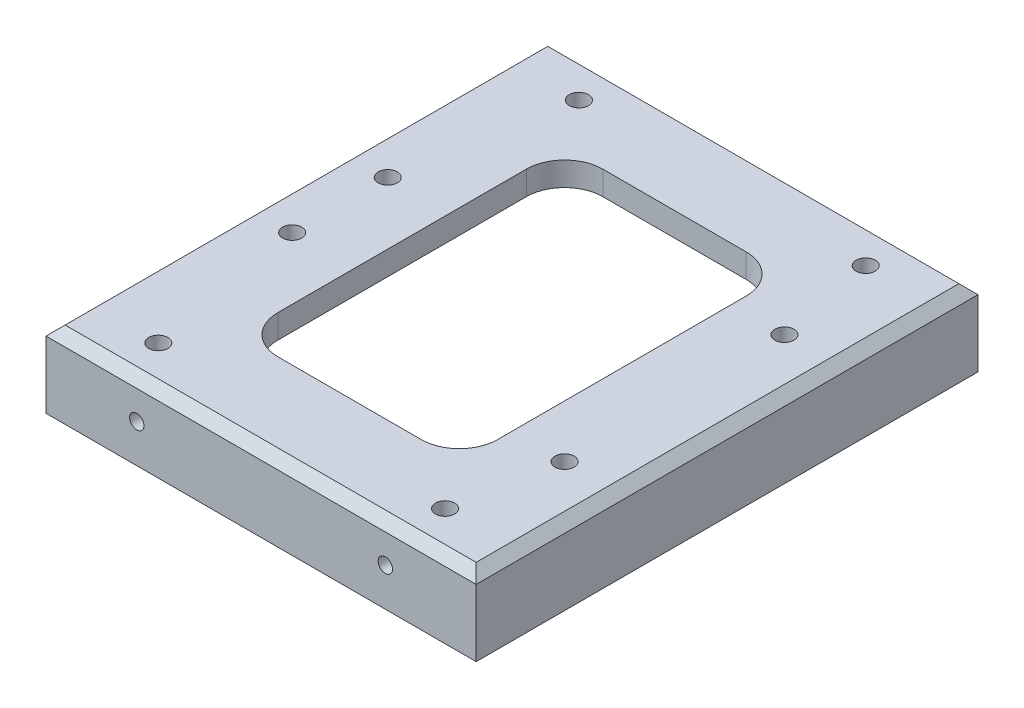
ISO-10303-21;
HEADER;
FILE_DESCRIPTION(('STEP AP214'),'2;1');
FILE_NAME('part.step','',(''),(''),'','','');
FILE_SCHEMA(('AUTOMOTIVE_DESIGN { 1 0 10303 214 1 1 1 1 }'));
ENDSEC;
DATA;
#1=APPLICATION_CONTEXT('core data for automotive mechanical design processes');
#2=APPLICATION_PROTOCOL_DEFINITION('international standard','automotive_design',2000,#1);
#3=PRODUCT_CONTEXT('',#1,'mechanical');
#4=PRODUCT('Part','Part','',(#3));
#5=PRODUCT_RELATED_PRODUCT_CATEGORY('part','',(#4));
#6=PRODUCT_DEFINITION_FORMATION('','',#4);
#7=PRODUCT_DEFINITION_CONTEXT('part definition',#1,'design');
#8=PRODUCT_DEFINITION('design','',#6,#7);
#9=PRODUCT_DEFINITION_SHAPE('','',#8);
#10=(LENGTH_UNIT() NAMED_UNIT(*) SI_UNIT(.MILLI.,.METRE.));
#11=(NAMED_UNIT(*) PLANE_ANGLE_UNIT() SI_UNIT($,.RADIAN.));
#12=(NAMED_UNIT(*) SI_UNIT($,.STERADIAN.) SOLID_ANGLE_UNIT());
#13=UNCERTAINTY_MEASURE_WITH_UNIT(LENGTH_MEASURE(1.E-05),#10,'distance_accuracy_value','');
#14=(GEOMETRIC_REPRESENTATION_CONTEXT(3) GLOBAL_UNCERTAINTY_ASSIGNED_CONTEXT((#13)) GLOBAL_UNIT_ASSIGNED_CONTEXT((#10,
#11,#12)) REPRESENTATION_CONTEXT('',''));
#15=CARTESIAN_POINT('',(0.,0.,0.));
#16=DIRECTION('',(0.,0.,1.));
#17=DIRECTION('',(1.,0.,0.));
#18=AXIS2_PLACEMENT_3D('',#15,#16,#17);
#19=CARTESIAN_POINT('',(45.,16.,-52.5));
#20=DIRECTION('',(-1.,0.,0.));
#21=DIRECTION('',(0.,0.,1.));
#22=AXIS2_PLACEMENT_3D('',#19,#20,#21);
#23=PLANE('',#22);
#24=DIRECTION('',(0.,-1.,0.));
#25=VECTOR('',#24,1.);
#26=CARTESIAN_POINT('',(45.,16.,-52.5));
#27=LINE('',#26,#25);
#28=CARTESIAN_POINT('',(45.,14.,-52.5));
#29=VERTEX_POINT('',#28);
#30=CARTESIAN_POINT('',(45.,0.,-52.5));
#31=VERTEX_POINT('',#30);
#32=EDGE_CURVE('E267',#29,#31,#27,.T.);
#33=ORIENTED_EDGE('',*,*,#32,.F.);
#34=DIRECTION('',(0.,0.,1.));
#35=VECTOR('',#34,1.);
#36=CARTESIAN_POINT('',(45.,14.,52.5));
#37=LINE('',#36,#35);
#38=CARTESIAN_POINT('',(45.,14.,52.5));
#39=VERTEX_POINT('',#38);
#40=EDGE_CURVE('E278',#29,#39,#37,.T.);
#41=ORIENTED_EDGE('',*,*,#40,.T.);
#42=DIRECTION('',(0.,-1.,0.));
#43=VECTOR('',#42,1.);
#44=CARTESIAN_POINT('',(45.,16.,52.5));
#45=LINE('',#44,#43);
#46=CARTESIAN_POINT('',(45.,0.,52.5));
#47=VERTEX_POINT('',#46);
#48=EDGE_CURVE('E261',#39,#47,#45,.T.);
#49=ORIENTED_EDGE('',*,*,#48,.T.);
#50=DIRECTION('',(0.,0.,-1.));
#51=VECTOR('',#50,1.);
#52=CARTESIAN_POINT('',(45.,0.,-52.5));
#53=LINE('',#52,#51);
#54=EDGE_CURVE('E248',#47,#31,#53,.T.);
#55=ORIENTED_EDGE('',*,*,#54,.T.);
#56=EDGE_LOOP('',(#33,#41,#49,#55));
#57=FACE_BOUND('',#56,.T.);
#58=ADVANCED_FACE('F39',(#57),#23,.F.);
#59=CARTESIAN_POINT('',(-45.,16.,-52.5));
#60=DIRECTION('',(0.,0.,1.));
#61=DIRECTION('',(1.,0.,0.));
#62=AXIS2_PLACEMENT_3D('',#59,#60,#61);
#63=PLANE('',#62);
#64=DIRECTION('',(0.,-1.,0.));
#65=VECTOR('',#64,1.);
#66=CARTESIAN_POINT('',(-45.,16.,-52.5));
#67=LINE('',#66,#65);
#68=CARTESIAN_POINT('',(-45.,14.,-52.5));
#69=VERTEX_POINT('',#68);
#70=CARTESIAN_POINT('',(-45.,0.,-52.5));
#71=VERTEX_POINT('',#70);
#72=EDGE_CURVE('E265',#69,#71,#67,.T.);
#73=ORIENTED_EDGE('',*,*,#72,.F.);
#74=DIRECTION('',(1.,0.,0.));
#75=VECTOR('',#74,1.);
#76=CARTESIAN_POINT('',(45.,14.,-52.5));
#77=LINE('',#76,#75);
#78=EDGE_CURVE('E285',#69,#29,#77,.T.);
#79=ORIENTED_EDGE('',*,*,#78,.T.);
#80=ORIENTED_EDGE('',*,*,#32,.T.);
#81=DIRECTION('',(-1.,0.,0.));
#82=VECTOR('',#81,1.);
#83=CARTESIAN_POINT('',(-45.,0.,-52.5));
#84=LINE('',#83,#82);
#85=EDGE_CURVE('E251',#31,#71,#84,.T.);
#86=ORIENTED_EDGE('',*,*,#85,.T.);
#87=EDGE_LOOP('',(#73,#79,#80,#86));
#88=FACE_BOUND('',#87,.T.);
#89=ADVANCED_FACE('F406',(#88),#63,.F.);
#90=CARTESIAN_POINT('',(-45.,16.,-52.5));
#91=DIRECTION('',(1.,0.,0.));
#92=DIRECTION('',(0.,0.,-1.));
#93=AXIS2_PLACEMENT_3D('',#90,#91,#92);
#94=PLANE('',#93);
#95=DIRECTION('',(0.,-1.,0.));
#96=VECTOR('',#95,1.);
#97=CARTESIAN_POINT('',(-45.,16.,52.5));
#98=LINE('',#97,#96);
#99=CARTESIAN_POINT('',(-45.,14.,52.5));
#100=VERTEX_POINT('',#99);
#101=CARTESIAN_POINT('',(-45.,0.,52.5));
#102=VERTEX_POINT('',#101);
#103=EDGE_CURVE('E263',#100,#102,#98,.T.);
#104=ORIENTED_EDGE('',*,*,#103,.F.);
#105=DIRECTION('',(0.,0.,-1.));
#106=VECTOR('',#105,1.);
#107=CARTESIAN_POINT('',(-45.,14.,-52.5));
#108=LINE('',#107,#106);
#109=EDGE_CURVE('E283',#100,#69,#108,.T.);
#110=ORIENTED_EDGE('',*,*,#109,.T.);
#111=ORIENTED_EDGE('',*,*,#72,.T.);
#112=DIRECTION('',(0.,0.,1.));
#113=VECTOR('',#112,1.);
#114=CARTESIAN_POINT('',(-45.,0.,-52.5));
#115=LINE('',#114,#113);
#116=EDGE_CURVE('E255',#71,#102,#115,.T.);
#117=ORIENTED_EDGE('',*,*,#116,.T.);
#118=EDGE_LOOP('',(#104,#110,#111,#117));
#119=FACE_BOUND('',#118,.T.);
#120=ADVANCED_FACE('F374',(#119),#94,.F.);
#121=CARTESIAN_POINT('',(-45.,16.,52.5));
#122=DIRECTION('',(0.,0.,-1.));
#123=DIRECTION('',(-1.,0.,0.));
#124=AXIS2_PLACEMENT_3D('',#121,#122,#123);
#125=PLANE('',#124);
#126=CARTESIAN_POINT('',(-26.,8.,52.5));
#127=DIRECTION('',(0.,0.,1.));
#128=DIRECTION('',(1.,0.,0.));
#129=AXIS2_PLACEMENT_3D('',#126,#127,#128);
#130=CIRCLE('',#129,1.5);
#131=CARTESIAN_POINT('',(-24.5,8.,52.5));
#132=VERTEX_POINT('',#131);
#133=EDGE_CURVE('E360',#132,#132,#130,.T.);
#134=ORIENTED_EDGE('',*,*,#133,.F.);
#135=EDGE_LOOP('',(#134));
#136=FACE_BOUND('',#135,.T.);
#137=CARTESIAN_POINT('',(26.,8.,52.5));
#138=DIRECTION('',(0.,0.,1.));
#139=DIRECTION('',(1.,0.,0.));
#140=AXIS2_PLACEMENT_3D('',#137,#138,#139);
#141=CIRCLE('',#140,1.5);
#142=CARTESIAN_POINT('',(27.5,8.,52.5));
#143=VERTEX_POINT('',#142);
#144=EDGE_CURVE('E361',#143,#143,#141,.T.);
#145=ORIENTED_EDGE('',*,*,#144,.F.);
#146=EDGE_LOOP('',(#145));
#147=FACE_BOUND('',#146,.T.);
#148=ORIENTED_EDGE('',*,*,#48,.F.);
#149=DIRECTION('',(-1.,0.,0.));
#150=VECTOR('',#149,1.);
#151=CARTESIAN_POINT('',(-45.,14.,52.5));
#152=LINE('',#151,#150);
#153=EDGE_CURVE('E281',#39,#100,#152,.T.);
#154=ORIENTED_EDGE('',*,*,#153,.T.);
#155=ORIENTED_EDGE('',*,*,#103,.T.);
#156=DIRECTION('',(1.,0.,0.));
#157=VECTOR('',#156,1.);
#158=CARTESIAN_POINT('',(-45.,0.,52.5));
#159=LINE('',#158,#157);
#160=EDGE_CURVE('E258',#102,#47,#159,.T.);
#161=ORIENTED_EDGE('',*,*,#160,.T.);
#162=EDGE_LOOP('',(#148,#154,#155,#161));
#163=FACE_BOUND('',#162,.T.);
#164=ADVANCED_FACE('F371',(#136,#147,#163),#125,.F.);
#165=CARTESIAN_POINT('',(0.,16.,0.));
#166=DIRECTION('',(0.,1.,0.));
#167=DIRECTION('',(0.,0.,1.));
#168=AXIS2_PLACEMENT_3D('',#165,#166,#167);
#169=PLANE('',#168);
#170=CARTESIAN_POINT('',(-30.,16.,44.));
#171=DIRECTION('',(0.,1.,0.));
#172=DIRECTION('',(0.,0.,1.));
#173=AXIS2_PLACEMENT_3D('',#170,#171,#172);
#174=CIRCLE('',#173,2.);
#175=CARTESIAN_POINT('',(-30.,16.,46.));
#176=VERTEX_POINT('',#175);
#177=EDGE_CURVE('E335',#176,#176,#174,.T.);
#178=ORIENTED_EDGE('',*,*,#177,.F.);
#179=EDGE_LOOP('',(#178));
#180=FACE_BOUND('',#179,.T.);
#181=CARTESIAN_POINT('',(30.,16.,44.));
#182=DIRECTION('',(0.,1.,0.));
#183=DIRECTION('',(0.,0.,1.));
#184=AXIS2_PLACEMENT_3D('',#181,#182,#183);
#185=CIRCLE('',#184,2.);
#186=CARTESIAN_POINT('',(30.,16.,46.));
#187=VERTEX_POINT('',#186);
#188=EDGE_CURVE('E343',#187,#187,#185,.T.);
#189=ORIENTED_EDGE('',*,*,#188,.F.);
#190=EDGE_LOOP('',(#189));
#191=FACE_BOUND('',#190,.T.);
#192=CARTESIAN_POINT('',(30.,16.,-44.));
#193=DIRECTION('',(0.,1.,0.));
#194=DIRECTION('',(0.,0.,1.));
#195=AXIS2_PLACEMENT_3D('',#192,#193,#194);
#196=CIRCLE('',#195,2.);
#197=CARTESIAN_POINT('',(30.,16.,-42.));
#198=VERTEX_POINT('',#197);
#199=EDGE_CURVE('E339',#198,#198,#196,.T.);
#200=ORIENTED_EDGE('',*,*,#199,.F.);
#201=EDGE_LOOP('',(#200));
#202=FACE_BOUND('',#201,.T.);
#203=CARTESIAN_POINT('',(-36.,16.,10.));
#204=DIRECTION('',(0.,1.,0.));
#205=DIRECTION('',(0.,0.,1.));
#206=AXIS2_PLACEMENT_3D('',#203,#204,#205);
#207=CIRCLE('',#206,2.);
#208=CARTESIAN_POINT('',(-36.,16.,12.));
#209=VERTEX_POINT('',#208);
#210=EDGE_CURVE('E336',#209,#209,#207,.T.);
#211=ORIENTED_EDGE('',*,*,#210,.F.);
#212=EDGE_LOOP('',(#211));
#213=FACE_BOUND('',#212,.T.);
#214=CARTESIAN_POINT('',(34.,16.,-23.));
#215=DIRECTION('',(0.,1.,0.));
#216=DIRECTION('',(0.,0.,1.));
#217=AXIS2_PLACEMENT_3D('',#214,#215,#216);
#218=CIRCLE('',#217,2.);
#219=CARTESIAN_POINT('',(34.,16.,-21.));
#220=VERTEX_POINT('',#219);
#221=EDGE_CURVE('E340',#220,#220,#218,.T.);
#222=ORIENTED_EDGE('',*,*,#221,.F.);
#223=EDGE_LOOP('',(#222));
#224=FACE_BOUND('',#223,.T.);
#225=CARTESIAN_POINT('',(-36.,16.,-9.99999999999999));
#226=DIRECTION('',(0.,1.,0.));
#227=DIRECTION('',(0.,0.,1.));
#228=AXIS2_PLACEMENT_3D('',#225,#226,#227);
#229=CIRCLE('',#228,2.);
#230=CARTESIAN_POINT('',(-36.,16.,-7.99999999999999));
#231=VERTEX_POINT('',#230);
#232=EDGE_CURVE('E351',#231,#231,#229,.T.);
#233=ORIENTED_EDGE('',*,*,#232,.F.);
#234=EDGE_LOOP('',(#233));
#235=FACE_BOUND('',#234,.T.);
#236=CARTESIAN_POINT('',(34.,16.,23.));
#237=DIRECTION('',(0.,1.,0.));
#238=DIRECTION('',(0.,0.,1.));
#239=AXIS2_PLACEMENT_3D('',#236,#237,#238);
#240=CIRCLE('',#239,2.);
#241=CARTESIAN_POINT('',(34.,16.,25.));
#242=VERTEX_POINT('',#241);
#243=EDGE_CURVE('E348',#242,#242,#240,.T.);
#244=ORIENTED_EDGE('',*,*,#243,.F.);
#245=EDGE_LOOP('',(#244));
#246=FACE_BOUND('',#245,.T.);
#247=CARTESIAN_POINT('',(-30.,16.,-44.));
#248=DIRECTION('',(0.,1.,0.));
#249=DIRECTION('',(0.,0.,1.));
#250=AXIS2_PLACEMENT_3D('',#247,#248,#249);
#251=CIRCLE('',#250,2.);
#252=CARTESIAN_POINT('',(-30.,16.,-42.));
#253=VERTEX_POINT('',#252);
#254=EDGE_CURVE('E311',#253,#253,#251,.T.);
#255=ORIENTED_EDGE('',*,*,#254,.F.);
#256=EDGE_LOOP('',(#255));
#257=FACE_BOUND('',#256,.T.);
#258=CARTESIAN_POINT('',(15.,16.,26.));
#259=DIRECTION('',(0.,1.,0.));
#260=DIRECTION('',(0.,0.,1.));
#261=AXIS2_PLACEMENT_3D('',#258,#259,#260);
#262=CIRCLE('',#261,8.);
#263=CARTESIAN_POINT('',(15.,16.,34.));
#264=VERTEX_POINT('',#263);
#265=CARTESIAN_POINT('',(23.,16.,25.9999999999999));
#266=VERTEX_POINT('',#265);
#267=EDGE_CURVE('E57',#264,#266,#262,.T.);
#268=ORIENTED_EDGE('',*,*,#267,.F.);
#269=DIRECTION('',(1.,0.,0.));
#270=VECTOR('',#269,1.);
#271=CARTESIAN_POINT('',(-14.9999999999999,16.,34.));
#272=LINE('',#271,#270);
#273=CARTESIAN_POINT('',(-14.9999999999999,16.,34.));
#274=VERTEX_POINT('',#273);
#275=EDGE_CURVE('E200',#274,#264,#272,.T.);
#276=ORIENTED_EDGE('',*,*,#275,.F.);
#277=CARTESIAN_POINT('',(-15.,16.,26.));
#278=DIRECTION('',(0.,1.,0.));
#279=DIRECTION('',(0.,0.,1.));
#280=AXIS2_PLACEMENT_3D('',#277,#278,#279);
#281=CIRCLE('',#280,8.);
#282=CARTESIAN_POINT('',(-23.,16.,25.9999999999999));
#283=VERTEX_POINT('',#282);
#284=EDGE_CURVE('E197',#283,#274,#281,.T.);
#285=ORIENTED_EDGE('',*,*,#284,.F.);
#286=DIRECTION('',(0.,0.,1.));
#287=VECTOR('',#286,1.);
#288=CARTESIAN_POINT('',(-23.,16.,-25.9999999999999));
#289=LINE('',#288,#287);
#290=CARTESIAN_POINT('',(-23.,16.,-25.9999999999999));
#291=VERTEX_POINT('',#290);
#292=EDGE_CURVE('E194',#291,#283,#289,.T.);
#293=ORIENTED_EDGE('',*,*,#292,.F.);
#294=CARTESIAN_POINT('',(-15.,16.,-26.));
#295=DIRECTION('',(0.,1.,0.));
#296=DIRECTION('',(0.,0.,1.));
#297=AXIS2_PLACEMENT_3D('',#294,#295,#296);
#298=CIRCLE('',#297,8.);
#299=CARTESIAN_POINT('',(-14.9999999999999,16.,-34.));
#300=VERTEX_POINT('',#299);
#301=EDGE_CURVE('E188',#300,#291,#298,.T.);
#302=ORIENTED_EDGE('',*,*,#301,.F.);
#303=DIRECTION('',(-1.,0.,0.));
#304=VECTOR('',#303,1.);
#305=CARTESIAN_POINT('',(-14.9999999999999,16.,-34.));
#306=LINE('',#305,#304);
#307=CARTESIAN_POINT('',(14.9999999999999,16.,-34.));
#308=VERTEX_POINT('',#307);
#309=EDGE_CURVE('E186',#308,#300,#306,.T.);
#310=ORIENTED_EDGE('',*,*,#309,.F.);
#311=CARTESIAN_POINT('',(15.,16.,-26.));
#312=DIRECTION('',(0.,1.,0.));
#313=DIRECTION('',(0.,0.,-1.));
#314=AXIS2_PLACEMENT_3D('',#311,#312,#313);
#315=CIRCLE('',#314,8.);
#316=CARTESIAN_POINT('',(23.,16.,-25.9999999999999));
#317=VERTEX_POINT('',#316);
#318=EDGE_CURVE('E169',#317,#308,#315,.T.);
#319=ORIENTED_EDGE('',*,*,#318,.F.);
#320=DIRECTION('',(0.,0.,-1.));
#321=VECTOR('',#320,1.);
#322=CARTESIAN_POINT('',(23.,16.,-25.9999999999999));
#323=LINE('',#322,#321);
#324=EDGE_CURVE('E178',#266,#317,#323,.T.);
#325=ORIENTED_EDGE('',*,*,#324,.F.);
#326=EDGE_LOOP('',(#268,#276,#285,#293,#302,#310,#319,#325));
#327=FACE_BOUND('',#326,.T.);
#328=DIRECTION('',(1.,0.,0.));
#329=VECTOR('',#328,1.);
#330=CARTESIAN_POINT('',(45.,16.,50.5));
#331=LINE('',#330,#329);
#332=CARTESIAN_POINT('',(-43.,16.,50.5));
#333=VERTEX_POINT('',#332);
#334=CARTESIAN_POINT('',(43.,16.,50.5));
#335=VERTEX_POINT('',#334);
#336=EDGE_CURVE('E273',#333,#335,#331,.T.);
#337=ORIENTED_EDGE('',*,*,#336,.T.);
#338=DIRECTION('',(0.,0.,-1.));
#339=VECTOR('',#338,1.);
#340=CARTESIAN_POINT('',(43.,16.,-52.5));
#341=LINE('',#340,#339);
#342=CARTESIAN_POINT('',(43.,16.,-50.5));
#343=VERTEX_POINT('',#342);
#344=EDGE_CURVE('E275',#335,#343,#341,.T.);
#345=ORIENTED_EDGE('',*,*,#344,.T.);
#346=DIRECTION('',(-1.,0.,0.));
#347=VECTOR('',#346,1.);
#348=CARTESIAN_POINT('',(-45.,16.,-50.5));
#349=LINE('',#348,#347);
#350=CARTESIAN_POINT('',(-43.,16.,-50.5));
#351=VERTEX_POINT('',#350);
#352=EDGE_CURVE('E269',#343,#351,#349,.T.);
#353=ORIENTED_EDGE('',*,*,#352,.T.);
#354=DIRECTION('',(0.,0.,1.));
#355=VECTOR('',#354,1.);
#356=CARTESIAN_POINT('',(-43.,16.,52.5));
#357=LINE('',#356,#355);
#358=EDGE_CURVE('E271',#351,#333,#357,.T.);
#359=ORIENTED_EDGE('',*,*,#358,.T.);
#360=EDGE_LOOP('',(#337,#345,#353,#359));
#361=FACE_BOUND('',#360,.T.);
#362=ADVANCED_FACE('F182',(#180,#191,#202,#213,#224,#235,#246,#257,#327,#361),#169,.T.);
#363=CARTESIAN_POINT('',(0.,0.,0.));
#364=DIRECTION('',(0.,1.,0.));
#365=DIRECTION('',(0.,0.,1.));
#366=AXIS2_PLACEMENT_3D('',#363,#364,#365);
#367=PLANE('',#366);
#368=DIRECTION('',(-1.,0.,0.));
#369=VECTOR('',#368,1.);
#370=CARTESIAN_POINT('',(-40.,0.,47.5));
#371=LINE('',#370,#369);
#372=CARTESIAN_POINT('',(40.,0.,47.5));
#373=VERTEX_POINT('',#372);
#374=CARTESIAN_POINT('',(-40.,0.,47.5));
#375=VERTEX_POINT('',#374);
#376=EDGE_CURVE('E231',#373,#375,#371,.T.);
#377=ORIENTED_EDGE('',*,*,#376,.F.);
#378=DIRECTION('',(0.,0.,1.));
#379=VECTOR('',#378,1.);
#380=CARTESIAN_POINT('',(40.,0.,47.5));
#381=LINE('',#380,#379);
#382=CARTESIAN_POINT('',(40.,0.,-47.5));
#383=VERTEX_POINT('',#382);
#384=EDGE_CURVE('E205',#383,#373,#381,.T.);
#385=ORIENTED_EDGE('',*,*,#384,.F.);
#386=DIRECTION('',(1.,0.,0.));
#387=VECTOR('',#386,1.);
#388=CARTESIAN_POINT('',(-40.,0.,-47.5));
#389=LINE('',#388,#387);
#390=CARTESIAN_POINT('',(-40.,0.,-47.5));
#391=VERTEX_POINT('',#390);
#392=EDGE_CURVE('E220',#391,#383,#389,.T.);
#393=ORIENTED_EDGE('',*,*,#392,.F.);
#394=DIRECTION('',(0.,0.,-1.));
#395=VECTOR('',#394,1.);
#396=CARTESIAN_POINT('',(-40.,0.,47.5));
#397=LINE('',#396,#395);
#398=EDGE_CURVE('E234',#375,#391,#397,.T.);
#399=ORIENTED_EDGE('',*,*,#398,.F.);
#400=EDGE_LOOP('',(#377,#385,#393,#399));
#401=FACE_BOUND('',#400,.T.);
#402=ORIENTED_EDGE('',*,*,#54,.F.);
#403=ORIENTED_EDGE('',*,*,#160,.F.);
#404=ORIENTED_EDGE('',*,*,#116,.F.);
#405=ORIENTED_EDGE('',*,*,#85,.F.);
#406=EDGE_LOOP('',(#402,#403,#404,#405));
#407=FACE_BOUND('',#406,.T.);
#408=ADVANCED_FACE('F410',(#401,#407),#367,.F.);
#409=CARTESIAN_POINT('',(-43.,16.,0.));
#410=DIRECTION('',(-0.70710678118655,0.707106781186545,0.));
#411=DIRECTION('',(0.,0.,-1.));
#412=AXIS2_PLACEMENT_3D('',#409,#410,#411);
#413=PLANE('',#412);
#414=DIRECTION('',(0.577350269189625,0.577350269189628,0.577350269189624));
#415=VECTOR('',#414,1.);
#416=CARTESIAN_POINT('',(-28.6666666666667,30.3333333333334,-36.1666666666667));
#417=LINE('',#416,#415);
#418=EDGE_CURVE('E291',#69,#351,#417,.T.);
#419=ORIENTED_EDGE('',*,*,#418,.F.);
#420=ORIENTED_EDGE('',*,*,#109,.F.);
#421=DIRECTION('',(0.577350269189624,0.577350269189628,-0.577350269189624));
#422=VECTOR('',#421,1.);
#423=CARTESIAN_POINT('',(-26.1666666666667,32.8333333333334,33.6666666666667));
#424=LINE('',#423,#422);
#425=EDGE_CURVE('E252',#333,#100,#424,.F.);
#426=ORIENTED_EDGE('',*,*,#425,.F.);
#427=ORIENTED_EDGE('',*,*,#358,.F.);
#428=EDGE_LOOP('',(#419,#420,#426,#427));
#429=FACE_BOUND('',#428,.T.);
#430=ADVANCED_FACE('F42',(#429),#413,.T.);
#431=CARTESIAN_POINT('',(0.,16.,50.5));
#432=DIRECTION('',(0.,0.707106781186545,0.70710678118655));
#433=DIRECTION('',(-1.,0.,0.));
#434=AXIS2_PLACEMENT_3D('',#431,#432,#433);
#435=PLANE('',#434);
#436=ORIENTED_EDGE('',*,*,#425,.T.);
#437=ORIENTED_EDGE('',*,*,#153,.F.);
#438=DIRECTION('',(-0.577350269189625,0.577350269189628,-0.577350269189624));
#439=VECTOR('',#438,1.);
#440=CARTESIAN_POINT('',(28.6666666666667,30.3333333333334,36.1666666666667));
#441=LINE('',#440,#439);
#442=EDGE_CURVE('E289',#335,#39,#441,.F.);
#443=ORIENTED_EDGE('',*,*,#442,.F.);
#444=ORIENTED_EDGE('',*,*,#336,.F.);
#445=EDGE_LOOP('',(#436,#437,#443,#444));
#446=FACE_BOUND('',#445,.T.);
#447=ADVANCED_FACE('F400',(#446),#435,.T.);
#448=CARTESIAN_POINT('',(0.,16.,-50.5));
#449=DIRECTION('',(0.,0.707106781186545,-0.70710678118655));
#450=DIRECTION('',(1.,0.,0.));
#451=AXIS2_PLACEMENT_3D('',#448,#449,#450);
#452=PLANE('',#451);
#453=ORIENTED_EDGE('',*,*,#418,.T.);
#454=ORIENTED_EDGE('',*,*,#352,.F.);
#455=DIRECTION('',(0.577350269189624,-0.577350269189628,-0.577350269189624));
#456=VECTOR('',#455,1.);
#457=CARTESIAN_POINT('',(28.6666666666667,30.3333333333334,-36.1666666666667));
#458=LINE('',#457,#456);
#459=EDGE_CURVE('E241',#29,#343,#458,.F.);
#460=ORIENTED_EDGE('',*,*,#459,.F.);
#461=ORIENTED_EDGE('',*,*,#78,.F.);
#462=EDGE_LOOP('',(#453,#454,#460,#461));
#463=FACE_BOUND('',#462,.T.);
#464=ADVANCED_FACE('F394',(#463),#452,.T.);
#465=CARTESIAN_POINT('',(43.,16.,0.));
#466=DIRECTION('',(0.70710678118655,0.707106781186545,0.));
#467=DIRECTION('',(0.,0.,1.));
#468=AXIS2_PLACEMENT_3D('',#465,#466,#467);
#469=PLANE('',#468);
#470=ORIENTED_EDGE('',*,*,#442,.T.);
#471=ORIENTED_EDGE('',*,*,#40,.F.);
#472=ORIENTED_EDGE('',*,*,#459,.T.);
#473=ORIENTED_EDGE('',*,*,#344,.F.);
#474=EDGE_LOOP('',(#470,#471,#472,#473));
#475=FACE_BOUND('',#474,.T.);
#476=ADVANCED_FACE('F388',(#475),#469,.T.);
#477=CARTESIAN_POINT('',(40.,11.,47.5));
#478=DIRECTION('',(1.,0.,0.));
#479=DIRECTION('',(0.,0.,-1.));
#480=AXIS2_PLACEMENT_3D('',#477,#478,#479);
#481=PLANE('',#480);
#482=ORIENTED_EDGE('',*,*,#384,.T.);
#483=DIRECTION('',(0.,-1.,0.));
#484=VECTOR('',#483,1.);
#485=CARTESIAN_POINT('',(40.,11.,47.5));
#486=LINE('',#485,#484);
#487=CARTESIAN_POINT('',(40.,11.,47.5));
#488=VERTEX_POINT('',#487);
#489=EDGE_CURVE('E229',#488,#373,#486,.T.);
#490=ORIENTED_EDGE('',*,*,#489,.F.);
#491=DIRECTION('',(0.,0.,1.));
#492=VECTOR('',#491,1.);
#493=CARTESIAN_POINT('',(40.,11.,47.5));
#494=LINE('',#493,#492);
#495=CARTESIAN_POINT('',(40.,11.,-47.5));
#496=VERTEX_POINT('',#495);
#497=EDGE_CURVE('E216',#496,#488,#494,.T.);
#498=ORIENTED_EDGE('',*,*,#497,.F.);
#499=DIRECTION('',(0.,-1.,0.));
#500=VECTOR('',#499,1.);
#501=CARTESIAN_POINT('',(40.,11.,-47.5));
#502=LINE('',#501,#500);
#503=EDGE_CURVE('E239',#496,#383,#502,.T.);
#504=ORIENTED_EDGE('',*,*,#503,.T.);
#505=EDGE_LOOP('',(#482,#490,#498,#504));
#506=FACE_BOUND('',#505,.T.);
#507=ADVANCED_FACE('F435',(#506),#481,.F.);
#508=CARTESIAN_POINT('',(-40.,11.,-47.5));
#509=DIRECTION('',(0.,0.,-1.));
#510=DIRECTION('',(-1.,0.,0.));
#511=AXIS2_PLACEMENT_3D('',#508,#509,#510);
#512=PLANE('',#511);
#513=ORIENTED_EDGE('',*,*,#392,.T.);
#514=ORIENTED_EDGE('',*,*,#503,.F.);
#515=DIRECTION('',(1.,0.,0.));
#516=VECTOR('',#515,1.);
#517=CARTESIAN_POINT('',(-40.,11.,-47.5));
#518=LINE('',#517,#516);
#519=CARTESIAN_POINT('',(-40.,11.,-47.5));
#520=VERTEX_POINT('',#519);
#521=EDGE_CURVE('E226',#520,#496,#518,.T.);
#522=ORIENTED_EDGE('',*,*,#521,.F.);
#523=DIRECTION('',(0.,-1.,0.));
#524=VECTOR('',#523,1.);
#525=CARTESIAN_POINT('',(-40.,11.,-47.5));
#526=LINE('',#525,#524);
#527=EDGE_CURVE('E242',#520,#391,#526,.T.);
#528=ORIENTED_EDGE('',*,*,#527,.T.);
#529=EDGE_LOOP('',(#513,#514,#522,#528));
#530=FACE_BOUND('',#529,.T.);
#531=ADVANCED_FACE('F461',(#530),#512,.F.);
#532=CARTESIAN_POINT('',(-40.,11.,47.5));
#533=DIRECTION('',(-1.,0.,0.));
#534=DIRECTION('',(0.,0.,1.));
#535=AXIS2_PLACEMENT_3D('',#532,#533,#534);
#536=PLANE('',#535);
#537=ORIENTED_EDGE('',*,*,#398,.T.);
#538=ORIENTED_EDGE('',*,*,#527,.F.);
#539=DIRECTION('',(0.,0.,-1.));
#540=VECTOR('',#539,1.);
#541=CARTESIAN_POINT('',(-40.,11.,47.5));
#542=LINE('',#541,#540);
#543=CARTESIAN_POINT('',(-40.,11.,47.5));
#544=VERTEX_POINT('',#543);
#545=EDGE_CURVE('E223',#544,#520,#542,.T.);
#546=ORIENTED_EDGE('',*,*,#545,.F.);
#547=DIRECTION('',(0.,-1.,0.));
#548=VECTOR('',#547,1.);
#549=CARTESIAN_POINT('',(-40.,11.,47.5));
#550=LINE('',#549,#548);
#551=EDGE_CURVE('E244',#544,#375,#550,.T.);
#552=ORIENTED_EDGE('',*,*,#551,.T.);
#553=EDGE_LOOP('',(#537,#538,#546,#552));
#554=FACE_BOUND('',#553,.T.);
#555=ADVANCED_FACE('F469',(#554),#536,.F.);
#556=CARTESIAN_POINT('',(-40.,11.,47.5));
#557=DIRECTION('',(0.,0.,1.));
#558=DIRECTION('',(1.,0.,0.));
#559=AXIS2_PLACEMENT_3D('',#556,#557,#558);
#560=PLANE('',#559);
#561=CARTESIAN_POINT('',(-26.,8.,47.5));
#562=DIRECTION('',(0.,0.,1.));
#563=DIRECTION('',(1.,0.,0.));
#564=AXIS2_PLACEMENT_3D('',#561,#562,#563);
#565=CIRCLE('',#564,1.5);
#566=CARTESIAN_POINT('',(-24.5,8.,47.5));
#567=VERTEX_POINT('',#566);
#568=EDGE_CURVE('E352',#567,#567,#565,.F.);
#569=ORIENTED_EDGE('',*,*,#568,.F.);
#570=EDGE_LOOP('',(#569));
#571=FACE_BOUND('',#570,.T.);
#572=CARTESIAN_POINT('',(26.,8.,47.5));
#573=DIRECTION('',(0.,0.,1.));
#574=DIRECTION('',(1.,0.,0.));
#575=AXIS2_PLACEMENT_3D('',#572,#573,#574);
#576=CIRCLE('',#575,1.5);
#577=CARTESIAN_POINT('',(27.5,8.,47.5));
#578=VERTEX_POINT('',#577);
#579=EDGE_CURVE('E357',#578,#578,#576,.F.);
#580=ORIENTED_EDGE('',*,*,#579,.F.);
#581=EDGE_LOOP('',(#580));
#582=FACE_BOUND('',#581,.T.);
#583=ORIENTED_EDGE('',*,*,#376,.T.);
#584=ORIENTED_EDGE('',*,*,#551,.F.);
#585=DIRECTION('',(-1.,0.,0.));
#586=VECTOR('',#585,1.);
#587=CARTESIAN_POINT('',(-40.,11.,47.5));
#588=LINE('',#587,#586);
#589=EDGE_CURVE('E219',#488,#544,#588,.T.);
#590=ORIENTED_EDGE('',*,*,#589,.F.);
#591=ORIENTED_EDGE('',*,*,#489,.T.);
#592=EDGE_LOOP('',(#583,#584,#590,#591));
#593=FACE_BOUND('',#592,.T.);
#594=ADVANCED_FACE('F477',(#571,#582,#593),#560,.F.);
#595=CARTESIAN_POINT('',(0.,11.,0.));
#596=DIRECTION('',(0.,-1.,0.));
#597=DIRECTION('',(0.,0.,-1.));
#598=AXIS2_PLACEMENT_3D('',#595,#596,#597);
#599=PLANE('',#598);
#600=CARTESIAN_POINT('',(-30.,11.,44.));
#601=DIRECTION('',(0.,-1.,0.));
#602=DIRECTION('',(0.,0.,-1.));
#603=AXIS2_PLACEMENT_3D('',#600,#601,#602);
#604=CIRCLE('',#603,2.);
#605=CARTESIAN_POINT('',(-30.,11.,42.));
#606=VERTEX_POINT('',#605);
#607=EDGE_CURVE('E44',#606,#606,#604,.T.);
#608=ORIENTED_EDGE('',*,*,#607,.F.);
#609=EDGE_LOOP('',(#608));
#610=FACE_BOUND('',#609,.T.);
#611=CARTESIAN_POINT('',(30.,11.,44.));
#612=DIRECTION('',(0.,-1.,0.));
#613=DIRECTION('',(0.,0.,-1.));
#614=AXIS2_PLACEMENT_3D('',#611,#612,#613);
#615=CIRCLE('',#614,2.);
#616=CARTESIAN_POINT('',(30.,11.,42.));
#617=VERTEX_POINT('',#616);
#618=EDGE_CURVE('E325',#617,#617,#615,.T.);
#619=ORIENTED_EDGE('',*,*,#618,.F.);
#620=EDGE_LOOP('',(#619));
#621=FACE_BOUND('',#620,.T.);
#622=CARTESIAN_POINT('',(30.,11.,-44.));
#623=DIRECTION('',(0.,-1.,0.));
#624=DIRECTION('',(0.,0.,-1.));
#625=AXIS2_PLACEMENT_3D('',#622,#623,#624);
#626=CIRCLE('',#625,2.);
#627=CARTESIAN_POINT('',(30.,11.,-46.));
#628=VERTEX_POINT('',#627);
#629=EDGE_CURVE('E323',#628,#628,#626,.T.);
#630=ORIENTED_EDGE('',*,*,#629,.F.);
#631=EDGE_LOOP('',(#630));
#632=FACE_BOUND('',#631,.T.);
#633=CARTESIAN_POINT('',(-36.,11.,10.));
#634=DIRECTION('',(0.,-1.,0.));
#635=DIRECTION('',(0.,0.,-1.));
#636=AXIS2_PLACEMENT_3D('',#633,#634,#635);
#637=CIRCLE('',#636,2.);
#638=CARTESIAN_POINT('',(-36.,11.,8.00000000000001));
#639=VERTEX_POINT('',#638);
#640=EDGE_CURVE('E320',#639,#639,#637,.T.);
#641=ORIENTED_EDGE('',*,*,#640,.F.);
#642=EDGE_LOOP('',(#641));
#643=FACE_BOUND('',#642,.T.);
#644=CARTESIAN_POINT('',(34.,11.,-23.));
#645=DIRECTION('',(0.,-1.,0.));
#646=DIRECTION('',(0.,0.,-1.));
#647=AXIS2_PLACEMENT_3D('',#644,#645,#646);
#648=CIRCLE('',#647,2.);
#649=CARTESIAN_POINT('',(34.,11.,-25.));
#650=VERTEX_POINT('',#649);
#651=EDGE_CURVE('E317',#650,#650,#648,.T.);
#652=ORIENTED_EDGE('',*,*,#651,.F.);
#653=EDGE_LOOP('',(#652));
#654=FACE_BOUND('',#653,.T.);
#655=CARTESIAN_POINT('',(-36.,11.,-9.99999999999999));
#656=DIRECTION('',(0.,-1.,0.));
#657=DIRECTION('',(0.,0.,-1.));
#658=AXIS2_PLACEMENT_3D('',#655,#656,#657);
#659=CIRCLE('',#658,2.);
#660=CARTESIAN_POINT('',(-36.,11.,-12.));
#661=VERTEX_POINT('',#660);
#662=EDGE_CURVE('E314',#661,#661,#659,.T.);
#663=ORIENTED_EDGE('',*,*,#662,.F.);
#664=EDGE_LOOP('',(#663));
#665=FACE_BOUND('',#664,.T.);
#666=CARTESIAN_POINT('',(34.,11.,23.));
#667=DIRECTION('',(0.,-1.,0.));
#668=DIRECTION('',(0.,0.,-1.));
#669=AXIS2_PLACEMENT_3D('',#666,#667,#668);
#670=CIRCLE('',#669,2.);
#671=CARTESIAN_POINT('',(34.,11.,21.));
#672=VERTEX_POINT('',#671);
#673=EDGE_CURVE('E310',#672,#672,#670,.T.);
#674=ORIENTED_EDGE('',*,*,#673,.F.);
#675=EDGE_LOOP('',(#674));
#676=FACE_BOUND('',#675,.T.);
#677=CARTESIAN_POINT('',(-30.,11.,-44.));
#678=DIRECTION('',(0.,-1.,0.));
#679=DIRECTION('',(0.,0.,-1.));
#680=AXIS2_PLACEMENT_3D('',#677,#678,#679);
#681=CIRCLE('',#680,2.);
#682=CARTESIAN_POINT('',(-30.,11.,-46.));
#683=VERTEX_POINT('',#682);
#684=EDGE_CURVE('E307',#683,#683,#681,.T.);
#685=ORIENTED_EDGE('',*,*,#684,.F.);
#686=EDGE_LOOP('',(#685));
#687=FACE_BOUND('',#686,.T.);
#688=CARTESIAN_POINT('',(15.,11.,26.));
#689=DIRECTION('',(0.,-1.,0.));
#690=DIRECTION('',(0.,0.,-1.));
#691=AXIS2_PLACEMENT_3D('',#688,#689,#690);
#692=CIRCLE('',#691,8.);
#693=CARTESIAN_POINT('',(23.,11.,25.9999999999999));
#694=VERTEX_POINT('',#693);
#695=CARTESIAN_POINT('',(15.,11.,34.));
#696=VERTEX_POINT('',#695);
#697=EDGE_CURVE('E11',#694,#696,#692,.T.);
#698=ORIENTED_EDGE('',*,*,#697,.F.);
#699=DIRECTION('',(0.,0.,1.));
#700=VECTOR('',#699,1.);
#701=CARTESIAN_POINT('',(23.,11.,0.));
#702=LINE('',#701,#700);
#703=CARTESIAN_POINT('',(23.,11.,-25.9999999999999));
#704=VERTEX_POINT('',#703);
#705=EDGE_CURVE('E287',#704,#694,#702,.T.);
#706=ORIENTED_EDGE('',*,*,#705,.F.);
#707=CARTESIAN_POINT('',(15.,11.,-26.));
#708=DIRECTION('',(0.,-1.,0.));
#709=DIRECTION('',(0.,0.,-1.));
#710=AXIS2_PLACEMENT_3D('',#707,#708,#709);
#711=CIRCLE('',#710,8.);
#712=CARTESIAN_POINT('',(14.9999999999999,11.,-34.));
#713=VERTEX_POINT('',#712);
#714=EDGE_CURVE('E172',#713,#704,#711,.T.);
#715=ORIENTED_EDGE('',*,*,#714,.F.);
#716=DIRECTION('',(1.,0.,0.));
#717=VECTOR('',#716,1.);
#718=CARTESIAN_POINT('',(0.,11.,-34.));
#719=LINE('',#718,#717);
#720=CARTESIAN_POINT('',(-14.9999999999999,11.,-34.));
#721=VERTEX_POINT('',#720);
#722=EDGE_CURVE('E298',#721,#713,#719,.T.);
#723=ORIENTED_EDGE('',*,*,#722,.F.);
#724=CARTESIAN_POINT('',(-15.,11.,-26.));
#725=DIRECTION('',(0.,-1.,0.));
#726=DIRECTION('',(0.,0.,-1.));
#727=AXIS2_PLACEMENT_3D('',#724,#725,#726);
#728=CIRCLE('',#727,8.);
#729=CARTESIAN_POINT('',(-23.,11.,-25.9999999999999));
#730=VERTEX_POINT('',#729);
#731=EDGE_CURVE('E300',#730,#721,#728,.T.);
#732=ORIENTED_EDGE('',*,*,#731,.F.);
#733=DIRECTION('',(0.,0.,-1.));
#734=VECTOR('',#733,1.);
#735=CARTESIAN_POINT('',(-23.,11.,0.));
#736=LINE('',#735,#734);
#737=CARTESIAN_POINT('',(-23.,11.,25.9999999999999));
#738=VERTEX_POINT('',#737);
#739=EDGE_CURVE('E302',#738,#730,#736,.T.);
#740=ORIENTED_EDGE('',*,*,#739,.F.);
#741=CARTESIAN_POINT('',(-15.,11.,26.));
#742=DIRECTION('',(0.,-1.,0.));
#743=DIRECTION('',(0.,0.,-1.));
#744=AXIS2_PLACEMENT_3D('',#741,#742,#743);
#745=CIRCLE('',#744,8.);
#746=CARTESIAN_POINT('',(-14.9999999999999,11.,34.));
#747=VERTEX_POINT('',#746);
#748=EDGE_CURVE('E304',#747,#738,#745,.T.);
#749=ORIENTED_EDGE('',*,*,#748,.F.);
#750=DIRECTION('',(-1.,0.,0.));
#751=VECTOR('',#750,1.);
#752=CARTESIAN_POINT('',(0.,11.,34.));
#753=LINE('',#752,#751);
#754=EDGE_CURVE('E49',#696,#747,#753,.T.);
#755=ORIENTED_EDGE('',*,*,#754,.F.);
#756=EDGE_LOOP('',(#698,#706,#715,#723,#732,#740,#749,#755));
#757=FACE_BOUND('',#756,.T.);
#758=ORIENTED_EDGE('',*,*,#497,.T.);
#759=ORIENTED_EDGE('',*,*,#589,.T.);
#760=ORIENTED_EDGE('',*,*,#545,.T.);
#761=ORIENTED_EDGE('',*,*,#521,.T.);
#762=EDGE_LOOP('',(#758,#759,#760,#761));
#763=FACE_BOUND('',#762,.T.);
#764=ADVANCED_FACE('F486',(#610,#621,#632,#643,#654,#665,#676,#687,#757,#763),#599,.T.);
#765=CARTESIAN_POINT('',(15.,0.,26.));
#766=DIRECTION('',(0.,1.,0.));
#767=DIRECTION('',(0.,0.,1.));
#768=AXIS2_PLACEMENT_3D('',#765,#766,#767);
#769=CYLINDRICAL_SURFACE('',#768,8.);
#770=ORIENTED_EDGE('',*,*,#697,.T.);
#771=DIRECTION('',(0.,1.,0.));
#772=VECTOR('',#771,1.);
#773=CARTESIAN_POINT('',(15.,0.,34.));
#774=LINE('',#773,#772);
#775=EDGE_CURVE('E203',#696,#264,#774,.T.);
#776=ORIENTED_EDGE('',*,*,#775,.T.);
#777=ORIENTED_EDGE('',*,*,#267,.T.);
#778=DIRECTION('',(0.,1.,0.));
#779=VECTOR('',#778,1.);
#780=CARTESIAN_POINT('',(23.,0.,25.9999999999999));
#781=LINE('',#780,#779);
#782=EDGE_CURVE('E175',#694,#266,#781,.T.);
#783=ORIENTED_EDGE('',*,*,#782,.F.);
#784=EDGE_LOOP('',(#770,#776,#777,#783));
#785=FACE_BOUND('',#784,.T.);
#786=ADVANCED_FACE('F496',(#785),#769,.F.);
#787=CARTESIAN_POINT('',(-14.9999999999999,0.,34.));
#788=DIRECTION('',(0.,0.,1.));
#789=DIRECTION('',(1.,0.,0.));
#790=AXIS2_PLACEMENT_3D('',#787,#788,#789);
#791=PLANE('',#790);
#792=ORIENTED_EDGE('',*,*,#754,.T.);
#793=DIRECTION('',(0.,1.,0.));
#794=VECTOR('',#793,1.);
#795=CARTESIAN_POINT('',(-14.9999999999999,0.,34.));
#796=LINE('',#795,#794);
#797=EDGE_CURVE('E206',#747,#274,#796,.T.);
#798=ORIENTED_EDGE('',*,*,#797,.T.);
#799=ORIENTED_EDGE('',*,*,#275,.T.);
#800=ORIENTED_EDGE('',*,*,#775,.F.);
#801=EDGE_LOOP('',(#792,#798,#799,#800));
#802=FACE_BOUND('',#801,.T.);
#803=ADVANCED_FACE('F505',(#802),#791,.F.);
#804=CARTESIAN_POINT('',(-15.,0.,26.));
#805=DIRECTION('',(0.,1.,0.));
#806=DIRECTION('',(0.,0.,1.));
#807=AXIS2_PLACEMENT_3D('',#804,#805,#806);
#808=CYLINDRICAL_SURFACE('',#807,8.);
#809=ORIENTED_EDGE('',*,*,#748,.T.);
#810=DIRECTION('',(0.,1.,0.));
#811=VECTOR('',#810,1.);
#812=CARTESIAN_POINT('',(-23.,0.,25.9999999999999));
#813=LINE('',#812,#811);
#814=EDGE_CURVE('E208',#738,#283,#813,.T.);
#815=ORIENTED_EDGE('',*,*,#814,.T.);
#816=ORIENTED_EDGE('',*,*,#284,.T.);
#817=ORIENTED_EDGE('',*,*,#797,.F.);
#818=EDGE_LOOP('',(#809,#815,#816,#817));
#819=FACE_BOUND('',#818,.T.);
#820=ADVANCED_FACE('F512',(#819),#808,.F.);
#821=CARTESIAN_POINT('',(-23.,0.,-25.9999999999999));
#822=DIRECTION('',(-1.,0.,0.));
#823=DIRECTION('',(0.,0.,1.));
#824=AXIS2_PLACEMENT_3D('',#821,#822,#823);
#825=PLANE('',#824);
#826=ORIENTED_EDGE('',*,*,#739,.T.);
#827=DIRECTION('',(0.,1.,0.));
#828=VECTOR('',#827,1.);
#829=CARTESIAN_POINT('',(-23.,0.,-25.9999999999999));
#830=LINE('',#829,#828);
#831=EDGE_CURVE('E210',#730,#291,#830,.T.);
#832=ORIENTED_EDGE('',*,*,#831,.T.);
#833=ORIENTED_EDGE('',*,*,#292,.T.);
#834=ORIENTED_EDGE('',*,*,#814,.F.);
#835=EDGE_LOOP('',(#826,#832,#833,#834));
#836=FACE_BOUND('',#835,.T.);
#837=ADVANCED_FACE('F520',(#836),#825,.F.);
#838=CARTESIAN_POINT('',(-15.,0.,-26.));
#839=DIRECTION('',(0.,1.,0.));
#840=DIRECTION('',(0.,0.,1.));
#841=AXIS2_PLACEMENT_3D('',#838,#839,#840);
#842=CYLINDRICAL_SURFACE('',#841,8.);
#843=ORIENTED_EDGE('',*,*,#731,.T.);
#844=DIRECTION('',(0.,1.,0.));
#845=VECTOR('',#844,1.);
#846=CARTESIAN_POINT('',(-14.9999999999999,0.,-34.));
#847=LINE('',#846,#845);
#848=EDGE_CURVE('E212',#721,#300,#847,.T.);
#849=ORIENTED_EDGE('',*,*,#848,.T.);
#850=ORIENTED_EDGE('',*,*,#301,.T.);
#851=ORIENTED_EDGE('',*,*,#831,.F.);
#852=EDGE_LOOP('',(#843,#849,#850,#851));
#853=FACE_BOUND('',#852,.T.);
#854=ADVANCED_FACE('F528',(#853),#842,.F.);
#855=CARTESIAN_POINT('',(-14.9999999999999,0.,-34.));
#856=DIRECTION('',(0.,0.,-1.));
#857=DIRECTION('',(-1.,0.,0.));
#858=AXIS2_PLACEMENT_3D('',#855,#856,#857);
#859=PLANE('',#858);
#860=ORIENTED_EDGE('',*,*,#722,.T.);
#861=DIRECTION('',(0.,1.,0.));
#862=VECTOR('',#861,1.);
#863=CARTESIAN_POINT('',(14.9999999999999,0.,-34.));
#864=LINE('',#863,#862);
#865=EDGE_CURVE('E174',#713,#308,#864,.T.);
#866=ORIENTED_EDGE('',*,*,#865,.T.);
#867=ORIENTED_EDGE('',*,*,#309,.T.);
#868=ORIENTED_EDGE('',*,*,#848,.F.);
#869=EDGE_LOOP('',(#860,#866,#867,#868));
#870=FACE_BOUND('',#869,.T.);
#871=ADVANCED_FACE('F536',(#870),#859,.F.);
#872=CARTESIAN_POINT('',(15.,0.,-26.));
#873=DIRECTION('',(0.,1.,0.));
#874=DIRECTION('',(0.,0.,1.));
#875=AXIS2_PLACEMENT_3D('',#872,#873,#874);
#876=CYLINDRICAL_SURFACE('',#875,8.);
#877=ORIENTED_EDGE('',*,*,#714,.T.);
#878=DIRECTION('',(0.,1.,0.));
#879=VECTOR('',#878,1.);
#880=CARTESIAN_POINT('',(23.,0.,-25.9999999999999));
#881=LINE('',#880,#879);
#882=EDGE_CURVE('E65',#704,#317,#881,.T.);
#883=ORIENTED_EDGE('',*,*,#882,.T.);
#884=ORIENTED_EDGE('',*,*,#318,.T.);
#885=ORIENTED_EDGE('',*,*,#865,.F.);
#886=EDGE_LOOP('',(#877,#883,#884,#885));
#887=FACE_BOUND('',#886,.T.);
#888=ADVANCED_FACE('F166',(#887),#876,.F.);
#889=CARTESIAN_POINT('',(23.,0.,-25.9999999999999));
#890=DIRECTION('',(1.,0.,0.));
#891=DIRECTION('',(0.,0.,-1.));
#892=AXIS2_PLACEMENT_3D('',#889,#890,#891);
#893=PLANE('',#892);
#894=ORIENTED_EDGE('',*,*,#705,.T.);
#895=ORIENTED_EDGE('',*,*,#782,.T.);
#896=ORIENTED_EDGE('',*,*,#324,.T.);
#897=ORIENTED_EDGE('',*,*,#882,.F.);
#898=EDGE_LOOP('',(#894,#895,#896,#897));
#899=FACE_BOUND('',#898,.T.);
#900=ADVANCED_FACE('F179',(#899),#893,.F.);
#901=CARTESIAN_POINT('',(-30.,0.,-44.));
#902=DIRECTION('',(0.,1.,0.));
#903=DIRECTION('',(0.,0.,1.));
#904=AXIS2_PLACEMENT_3D('',#901,#902,#903);
#905=CYLINDRICAL_SURFACE('',#904,2.);
#906=ORIENTED_EDGE('',*,*,#684,.T.);
#907=EDGE_LOOP('',(#906));
#908=FACE_BOUND('',#907,.T.);
#909=ORIENTED_EDGE('',*,*,#254,.T.);
#910=EDGE_LOOP('',(#909));
#911=FACE_BOUND('',#910,.T.);
#912=ADVANCED_FACE('F557',(#908,#911),#905,.F.);
#913=CARTESIAN_POINT('',(34.,0.,23.));
#914=DIRECTION('',(0.,1.,0.));
#915=DIRECTION('',(0.,0.,1.));
#916=AXIS2_PLACEMENT_3D('',#913,#914,#915);
#917=CYLINDRICAL_SURFACE('',#916,2.);
#918=ORIENTED_EDGE('',*,*,#673,.T.);
#919=EDGE_LOOP('',(#918));
#920=FACE_BOUND('',#919,.T.);
#921=ORIENTED_EDGE('',*,*,#243,.T.);
#922=EDGE_LOOP('',(#921));
#923=FACE_BOUND('',#922,.T.);
#924=ADVANCED_FACE('F563',(#920,#923),#917,.F.);
#925=CARTESIAN_POINT('',(-36.,0.,-9.99999999999999));
#926=DIRECTION('',(0.,1.,0.));
#927=DIRECTION('',(0.,0.,1.));
#928=AXIS2_PLACEMENT_3D('',#925,#926,#927);
#929=CYLINDRICAL_SURFACE('',#928,2.);
#930=ORIENTED_EDGE('',*,*,#662,.T.);
#931=EDGE_LOOP('',(#930));
#932=FACE_BOUND('',#931,.T.);
#933=ORIENTED_EDGE('',*,*,#232,.T.);
#934=EDGE_LOOP('',(#933));
#935=FACE_BOUND('',#934,.T.);
#936=ADVANCED_FACE('F571',(#932,#935),#929,.F.);
#937=CARTESIAN_POINT('',(34.,0.,-23.));
#938=DIRECTION('',(0.,1.,0.));
#939=DIRECTION('',(0.,0.,1.));
#940=AXIS2_PLACEMENT_3D('',#937,#938,#939);
#941=CYLINDRICAL_SURFACE('',#940,2.);
#942=ORIENTED_EDGE('',*,*,#651,.T.);
#943=EDGE_LOOP('',(#942));
#944=FACE_BOUND('',#943,.T.);
#945=ORIENTED_EDGE('',*,*,#221,.T.);
#946=EDGE_LOOP('',(#945));
#947=FACE_BOUND('',#946,.T.);
#948=ADVANCED_FACE('F579',(#944,#947),#941,.F.);
#949=CARTESIAN_POINT('',(-36.,0.,10.));
#950=DIRECTION('',(0.,1.,0.));
#951=DIRECTION('',(0.,0.,1.));
#952=AXIS2_PLACEMENT_3D('',#949,#950,#951);
#953=CYLINDRICAL_SURFACE('',#952,2.);
#954=ORIENTED_EDGE('',*,*,#640,.T.);
#955=EDGE_LOOP('',(#954));
#956=FACE_BOUND('',#955,.T.);
#957=ORIENTED_EDGE('',*,*,#210,.T.);
#958=EDGE_LOOP('',(#957));
#959=FACE_BOUND('',#958,.T.);
#960=ADVANCED_FACE('F587',(#956,#959),#953,.F.);
#961=CARTESIAN_POINT('',(30.,0.,-44.));
#962=DIRECTION('',(0.,1.,0.));
#963=DIRECTION('',(0.,0.,1.));
#964=AXIS2_PLACEMENT_3D('',#961,#962,#963);
#965=CYLINDRICAL_SURFACE('',#964,2.);
#966=ORIENTED_EDGE('',*,*,#629,.T.);
#967=EDGE_LOOP('',(#966));
#968=FACE_BOUND('',#967,.T.);
#969=ORIENTED_EDGE('',*,*,#199,.T.);
#970=EDGE_LOOP('',(#969));
#971=FACE_BOUND('',#970,.T.);
#972=ADVANCED_FACE('F595',(#968,#971),#965,.F.);
#973=CARTESIAN_POINT('',(30.,0.,44.));
#974=DIRECTION('',(0.,1.,0.));
#975=DIRECTION('',(0.,0.,1.));
#976=AXIS2_PLACEMENT_3D('',#973,#974,#975);
#977=CYLINDRICAL_SURFACE('',#976,2.);
#978=ORIENTED_EDGE('',*,*,#618,.T.);
#979=EDGE_LOOP('',(#978));
#980=FACE_BOUND('',#979,.T.);
#981=ORIENTED_EDGE('',*,*,#188,.T.);
#982=EDGE_LOOP('',(#981));
#983=FACE_BOUND('',#982,.T.);
#984=ADVANCED_FACE('F603',(#980,#983),#977,.F.);
#985=CARTESIAN_POINT('',(-30.,0.,44.));
#986=DIRECTION('',(0.,1.,0.));
#987=DIRECTION('',(0.,0.,1.));
#988=AXIS2_PLACEMENT_3D('',#985,#986,#987);
#989=CYLINDRICAL_SURFACE('',#988,2.);
#990=ORIENTED_EDGE('',*,*,#607,.T.);
#991=EDGE_LOOP('',(#990));
#992=FACE_BOUND('',#991,.T.);
#993=ORIENTED_EDGE('',*,*,#177,.T.);
#994=EDGE_LOOP('',(#993));
#995=FACE_BOUND('',#994,.T.);
#996=ADVANCED_FACE('F611',(#992,#995),#989,.F.);
#997=CARTESIAN_POINT('',(26.,8.,43.2573593128807));
#998=DIRECTION('',(0.,0.,1.));
#999=DIRECTION('',(1.,0.,0.));
#1000=AXIS2_PLACEMENT_3D('',#997,#998,#999);
#1001=CYLINDRICAL_SURFACE('',#1000,1.5);
#1002=ORIENTED_EDGE('',*,*,#579,.T.);
#1003=EDGE_LOOP('',(#1002));
#1004=FACE_BOUND('',#1003,.T.);
#1005=ORIENTED_EDGE('',*,*,#144,.T.);
#1006=EDGE_LOOP('',(#1005));
#1007=FACE_BOUND('',#1006,.T.);
#1008=ADVANCED_FACE('F618',(#1004,#1007),#1001,.F.);
#1009=CARTESIAN_POINT('',(-26.,8.,43.2573593128807));
#1010=DIRECTION('',(0.,0.,1.));
#1011=DIRECTION('',(1.,0.,0.));
#1012=AXIS2_PLACEMENT_3D('',#1009,#1010,#1011);
#1013=CYLINDRICAL_SURFACE('',#1012,1.5);
#1014=ORIENTED_EDGE('',*,*,#568,.T.);
#1015=EDGE_LOOP('',(#1014));
#1016=FACE_BOUND('',#1015,.T.);
#1017=ORIENTED_EDGE('',*,*,#133,.T.);
#1018=EDGE_LOOP('',(#1017));
#1019=FACE_BOUND('',#1018,.T.);
#1020=ADVANCED_FACE('F369',(#1016,#1019),#1013,.F.);
#1021=CLOSED_SHELL('',(#58,#89,#120,#164,#362,#408,#430,#447,#464,#476,#507,#531,#555,#594,#764,
#786,#803,#820,#837,#854,#871,#888,#900,#912,#924,#936,#948,#960,#972,#984,#996,#1008,#1020));
#1022=MANIFOLD_SOLID_BREP('B2',#1021);
#1023=ADVANCED_BREP_SHAPE_REPRESENTATION('',(#18,#1022),#14);
#1024=SHAPE_DEFINITION_REPRESENTATION(#9,#1023);
ENDSEC;
END-ISO-10303-21;
